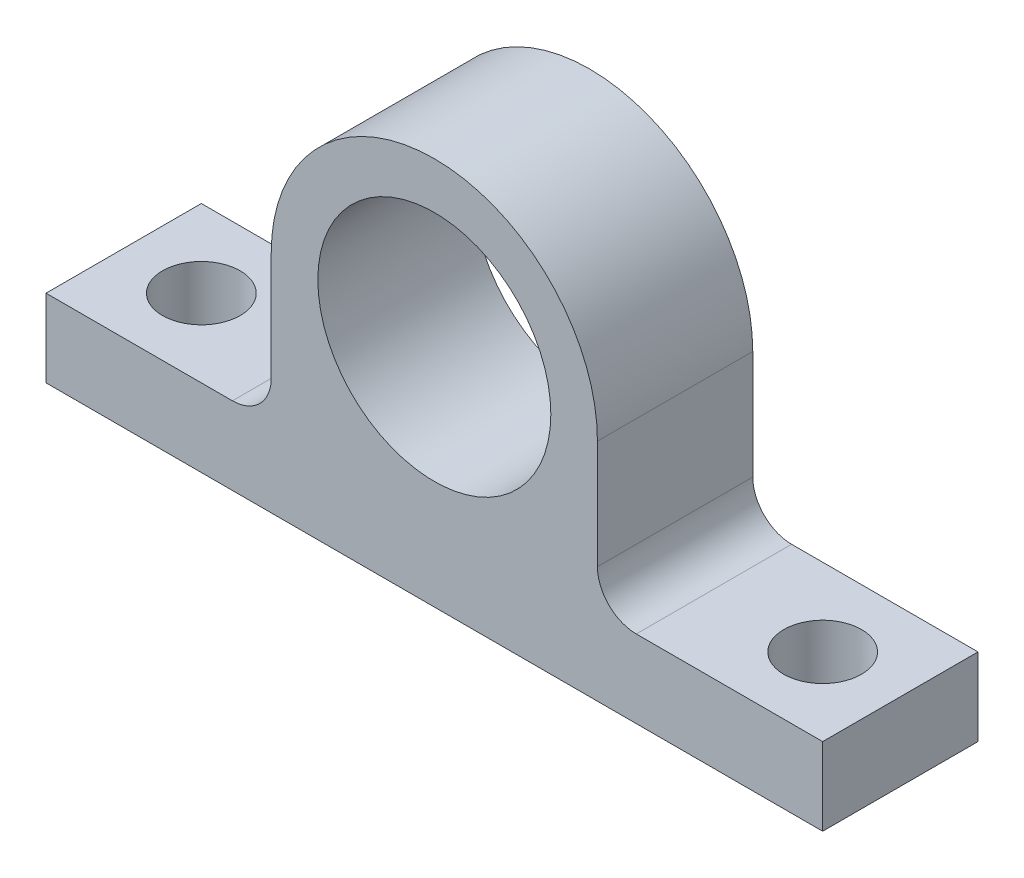
ISO-10303-21;
HEADER;
FILE_DESCRIPTION(('STEP AP214'),'2;1');
FILE_NAME('part.step','',(''),(''),'','','');
FILE_SCHEMA(('AUTOMOTIVE_DESIGN { 1 0 10303 214 1 1 1 1 }'));
ENDSEC;
DATA;
#1=APPLICATION_CONTEXT('core data for automotive mechanical design processes');
#2=APPLICATION_PROTOCOL_DEFINITION('international standard','automotive_design',2000,#1);
#3=PRODUCT_CONTEXT('',#1,'mechanical');
#4=PRODUCT('Part','Part','',(#3));
#5=PRODUCT_RELATED_PRODUCT_CATEGORY('part','',(#4));
#6=PRODUCT_DEFINITION_FORMATION('','',#4);
#7=PRODUCT_DEFINITION_CONTEXT('part definition',#1,'design');
#8=PRODUCT_DEFINITION('design','',#6,#7);
#9=PRODUCT_DEFINITION_SHAPE('','',#8);
#10=(LENGTH_UNIT() NAMED_UNIT(*) SI_UNIT(.MILLI.,.METRE.));
#11=(NAMED_UNIT(*) PLANE_ANGLE_UNIT() SI_UNIT($,.RADIAN.));
#12=(NAMED_UNIT(*) SI_UNIT($,.STERADIAN.) SOLID_ANGLE_UNIT());
#13=UNCERTAINTY_MEASURE_WITH_UNIT(LENGTH_MEASURE(1.E-05),#10,'distance_accuracy_value','');
#14=(GEOMETRIC_REPRESENTATION_CONTEXT(3) GLOBAL_UNCERTAINTY_ASSIGNED_CONTEXT((#13)) GLOBAL_UNIT_ASSIGNED_CONTEXT((#10,
#11,#12)) REPRESENTATION_CONTEXT('',''));
#15=CARTESIAN_POINT('',(0.,0.,0.));
#16=DIRECTION('',(0.,0.,1.));
#17=DIRECTION('',(1.,0.,0.));
#18=AXIS2_PLACEMENT_3D('',#15,#16,#17);
#19=CARTESIAN_POINT('',(0.,14.5,10.));
#20=DIRECTION('',(0.,0.,1.));
#21=DIRECTION('',(1.,0.,0.));
#22=AXIS2_PLACEMENT_3D('',#19,#20,#21);
#23=PLANE('',#22);
#24=CARTESIAN_POINT('',(0.,14.5,10.));
#25=DIRECTION('',(0.,0.,1.));
#26=DIRECTION('',(1.,0.,0.));
#27=AXIS2_PLACEMENT_3D('',#24,#25,#26);
#28=CIRCLE('',#27,10.5);
#29=CARTESIAN_POINT('',(10.5,14.5,10.));
#30=VERTEX_POINT('',#29);
#31=CARTESIAN_POINT('',(-10.5,14.5,10.));
#32=VERTEX_POINT('',#31);
#33=EDGE_CURVE('E161',#30,#32,#28,.T.);
#34=ORIENTED_EDGE('',*,*,#33,.T.);
#35=DIRECTION('',(0.,-1.,0.));
#36=VECTOR('',#35,1.);
#37=CARTESIAN_POINT('',(-10.5,14.5,10.));
#38=LINE('',#37,#36);
#39=CARTESIAN_POINT('',(-10.5,7.50000000000002,10.));
#40=VERTEX_POINT('',#39);
#41=EDGE_CURVE('E99',#32,#40,#38,.T.);
#42=ORIENTED_EDGE('',*,*,#41,.T.);
#43=CARTESIAN_POINT('',(-13.,7.5,10.));
#44=DIRECTION('',(0.,0.,-1.));
#45=DIRECTION('',(-1.,0.,0.));
#46=AXIS2_PLACEMENT_3D('',#43,#44,#45);
#47=CIRCLE('',#46,2.5);
#48=CARTESIAN_POINT('',(-13.,5.,10.));
#49=VERTEX_POINT('',#48);
#50=EDGE_CURVE('E183',#40,#49,#47,.T.);
#51=ORIENTED_EDGE('',*,*,#50,.T.);
#52=DIRECTION('',(-1.,0.,0.));
#53=VECTOR('',#52,1.);
#54=CARTESIAN_POINT('',(-25.,5.,10.));
#55=LINE('',#54,#53);
#56=CARTESIAN_POINT('',(-25.,5.,10.));
#57=VERTEX_POINT('',#56);
#58=EDGE_CURVE('E202',#49,#57,#55,.T.);
#59=ORIENTED_EDGE('',*,*,#58,.T.);
#60=DIRECTION('',(0.,-1.,0.));
#61=VECTOR('',#60,1.);
#62=CARTESIAN_POINT('',(-25.,0.,10.));
#63=LINE('',#62,#61);
#64=CARTESIAN_POINT('',(-25.,0.,10.));
#65=VERTEX_POINT('',#64);
#66=EDGE_CURVE('E199',#57,#65,#63,.T.);
#67=ORIENTED_EDGE('',*,*,#66,.T.);
#68=DIRECTION('',(1.,0.,0.));
#69=VECTOR('',#68,1.);
#70=CARTESIAN_POINT('',(25.,0.,10.));
#71=LINE('',#70,#69);
#72=CARTESIAN_POINT('',(25.,0.,10.));
#73=VERTEX_POINT('',#72);
#74=EDGE_CURVE('E201',#65,#73,#71,.T.);
#75=ORIENTED_EDGE('',*,*,#74,.T.);
#76=DIRECTION('',(0.,1.,0.));
#77=VECTOR('',#76,1.);
#78=CARTESIAN_POINT('',(25.,0.,10.));
#79=LINE('',#78,#77);
#80=CARTESIAN_POINT('',(25.,5.,10.));
#81=VERTEX_POINT('',#80);
#82=EDGE_CURVE('E124',#73,#81,#79,.T.);
#83=ORIENTED_EDGE('',*,*,#82,.T.);
#84=DIRECTION('',(-1.,0.,0.));
#85=VECTOR('',#84,1.);
#86=CARTESIAN_POINT('',(25.,5.,10.));
#87=LINE('',#86,#85);
#88=CARTESIAN_POINT('',(13.,5.,10.));
#89=VERTEX_POINT('',#88);
#90=EDGE_CURVE('E118',#81,#89,#87,.T.);
#91=ORIENTED_EDGE('',*,*,#90,.T.);
#92=CARTESIAN_POINT('',(13.,7.5,10.));
#93=DIRECTION('',(0.,0.,-1.));
#94=DIRECTION('',(1.,0.,0.));
#95=AXIS2_PLACEMENT_3D('',#92,#93,#94);
#96=CIRCLE('',#95,2.5);
#97=CARTESIAN_POINT('',(10.5,7.50000000000002,10.));
#98=VERTEX_POINT('',#97);
#99=EDGE_CURVE('E122',#89,#98,#96,.T.);
#100=ORIENTED_EDGE('',*,*,#99,.T.);
#101=DIRECTION('',(0.,1.,0.));
#102=VECTOR('',#101,1.);
#103=CARTESIAN_POINT('',(10.5,14.5,10.));
#104=LINE('',#103,#102);
#105=EDGE_CURVE('E50',#98,#30,#104,.T.);
#106=ORIENTED_EDGE('',*,*,#105,.T.);
#107=EDGE_LOOP('',(#34,#42,#51,#59,#67,#75,#83,#91,#100,#106));
#108=FACE_BOUND('',#107,.T.);
#109=CARTESIAN_POINT('',(0.,14.5,10.));
#110=DIRECTION('',(0.,0.,1.));
#111=DIRECTION('',(1.,0.,0.));
#112=AXIS2_PLACEMENT_3D('',#109,#110,#111);
#113=CIRCLE('',#112,7.5);
#114=CARTESIAN_POINT('',(7.5,14.5,10.));
#115=VERTEX_POINT('',#114);
#116=EDGE_CURVE('E146',#115,#115,#113,.T.);
#117=ORIENTED_EDGE('',*,*,#116,.F.);
#118=EDGE_LOOP('',(#117));
#119=FACE_BOUND('',#118,.T.);
#120=ADVANCED_FACE('F32',(#108,#119),#23,.T.);
#121=CARTESIAN_POINT('',(0.,14.5,0.));
#122=DIRECTION('',(0.,0.,1.));
#123=DIRECTION('',(1.,0.,0.));
#124=AXIS2_PLACEMENT_3D('',#121,#122,#123);
#125=PLANE('',#124);
#126=CARTESIAN_POINT('',(0.,14.5,0.));
#127=DIRECTION('',(0.,0.,1.));
#128=DIRECTION('',(1.,0.,0.));
#129=AXIS2_PLACEMENT_3D('',#126,#127,#128);
#130=CIRCLE('',#129,10.5);
#131=CARTESIAN_POINT('',(10.5,14.5,0.));
#132=VERTEX_POINT('',#131);
#133=CARTESIAN_POINT('',(-10.5,14.5,0.));
#134=VERTEX_POINT('',#133);
#135=EDGE_CURVE('E142',#132,#134,#130,.T.);
#136=ORIENTED_EDGE('',*,*,#135,.F.);
#137=DIRECTION('',(0.,1.,0.));
#138=VECTOR('',#137,1.);
#139=CARTESIAN_POINT('',(10.5,14.5,0.));
#140=LINE('',#139,#138);
#141=CARTESIAN_POINT('',(10.5,7.50000000000002,0.));
#142=VERTEX_POINT('',#141);
#143=EDGE_CURVE('E91',#142,#132,#140,.T.);
#144=ORIENTED_EDGE('',*,*,#143,.F.);
#145=CARTESIAN_POINT('',(13.,7.5,0.));
#146=DIRECTION('',(0.,0.,-1.));
#147=DIRECTION('',(1.,0.,0.));
#148=AXIS2_PLACEMENT_3D('',#145,#146,#147);
#149=CIRCLE('',#148,2.5);
#150=CARTESIAN_POINT('',(13.,5.,0.));
#151=VERTEX_POINT('',#150);
#152=EDGE_CURVE('E85',#151,#142,#149,.T.);
#153=ORIENTED_EDGE('',*,*,#152,.F.);
#154=DIRECTION('',(-1.,0.,0.));
#155=VECTOR('',#154,1.);
#156=CARTESIAN_POINT('',(25.,5.,0.));
#157=LINE('',#156,#155);
#158=CARTESIAN_POINT('',(25.,5.,0.));
#159=VERTEX_POINT('',#158);
#160=EDGE_CURVE('E132',#159,#151,#157,.T.);
#161=ORIENTED_EDGE('',*,*,#160,.F.);
#162=DIRECTION('',(0.,1.,0.));
#163=VECTOR('',#162,1.);
#164=CARTESIAN_POINT('',(25.,0.,0.));
#165=LINE('',#164,#163);
#166=CARTESIAN_POINT('',(25.,0.,0.));
#167=VERTEX_POINT('',#166);
#168=EDGE_CURVE('E156',#167,#159,#165,.T.);
#169=ORIENTED_EDGE('',*,*,#168,.F.);
#170=DIRECTION('',(1.,0.,0.));
#171=VECTOR('',#170,1.);
#172=CARTESIAN_POINT('',(25.,0.,0.));
#173=LINE('',#172,#171);
#174=CARTESIAN_POINT('',(-25.,0.,0.));
#175=VERTEX_POINT('',#174);
#176=EDGE_CURVE('E154',#175,#167,#173,.T.);
#177=ORIENTED_EDGE('',*,*,#176,.F.);
#178=DIRECTION('',(0.,-1.,0.));
#179=VECTOR('',#178,1.);
#180=CARTESIAN_POINT('',(-25.,0.,0.));
#181=LINE('',#180,#179);
#182=CARTESIAN_POINT('',(-25.,5.,0.));
#183=VERTEX_POINT('',#182);
#184=EDGE_CURVE('E152',#183,#175,#181,.T.);
#185=ORIENTED_EDGE('',*,*,#184,.F.);
#186=DIRECTION('',(-1.,0.,0.));
#187=VECTOR('',#186,1.);
#188=CARTESIAN_POINT('',(-25.,5.,0.));
#189=LINE('',#188,#187);
#190=CARTESIAN_POINT('',(-13.,5.,0.));
#191=VERTEX_POINT('',#190);
#192=EDGE_CURVE('E150',#191,#183,#189,.T.);
#193=ORIENTED_EDGE('',*,*,#192,.F.);
#194=CARTESIAN_POINT('',(-13.,7.5,0.));
#195=DIRECTION('',(0.,0.,-1.));
#196=DIRECTION('',(-1.,0.,0.));
#197=AXIS2_PLACEMENT_3D('',#194,#195,#196);
#198=CIRCLE('',#197,2.5);
#199=CARTESIAN_POINT('',(-10.5,7.50000000000002,0.));
#200=VERTEX_POINT('',#199);
#201=EDGE_CURVE('E148',#200,#191,#198,.T.);
#202=ORIENTED_EDGE('',*,*,#201,.F.);
#203=DIRECTION('',(0.,-1.,0.));
#204=VECTOR('',#203,1.);
#205=CARTESIAN_POINT('',(-10.5,14.5,0.));
#206=LINE('',#205,#204);
#207=EDGE_CURVE('E145',#134,#200,#206,.T.);
#208=ORIENTED_EDGE('',*,*,#207,.F.);
#209=EDGE_LOOP('',(#136,#144,#153,#161,#169,#177,#185,#193,#202,#208));
#210=FACE_BOUND('',#209,.T.);
#211=CARTESIAN_POINT('',(0.,14.5,0.));
#212=DIRECTION('',(0.,0.,1.));
#213=DIRECTION('',(1.,0.,0.));
#214=AXIS2_PLACEMENT_3D('',#211,#212,#213);
#215=CIRCLE('',#214,7.5);
#216=CARTESIAN_POINT('',(7.5,14.5,0.));
#217=VERTEX_POINT('',#216);
#218=EDGE_CURVE('E210',#217,#217,#215,.T.);
#219=ORIENTED_EDGE('',*,*,#218,.T.);
#220=EDGE_LOOP('',(#219));
#221=FACE_BOUND('',#220,.T.);
#222=ADVANCED_FACE('F187',(#210,#221),#125,.F.);
#223=CARTESIAN_POINT('',(0.,14.5,10.));
#224=DIRECTION('',(0.,0.,-1.));
#225=DIRECTION('',(-1.,0.,0.));
#226=AXIS2_PLACEMENT_3D('',#223,#224,#225);
#227=CYLINDRICAL_SURFACE('',#226,10.5);
#228=ORIENTED_EDGE('',*,*,#135,.T.);
#229=DIRECTION('',(0.,0.,-1.));
#230=VECTOR('',#229,1.);
#231=CARTESIAN_POINT('',(-10.5,14.5,10.));
#232=LINE('',#231,#230);
#233=EDGE_CURVE('E11',#32,#134,#232,.T.);
#234=ORIENTED_EDGE('',*,*,#233,.F.);
#235=ORIENTED_EDGE('',*,*,#33,.F.);
#236=DIRECTION('',(0.,0.,-1.));
#237=VECTOR('',#236,1.);
#238=CARTESIAN_POINT('',(10.5,14.5,10.));
#239=LINE('',#238,#237);
#240=EDGE_CURVE('E138',#30,#132,#239,.T.);
#241=ORIENTED_EDGE('',*,*,#240,.T.);
#242=EDGE_LOOP('',(#228,#234,#235,#241));
#243=FACE_BOUND('',#242,.T.);
#244=ADVANCED_FACE('F34',(#243),#227,.T.);
#245=CARTESIAN_POINT('',(-10.5,14.5,10.));
#246=DIRECTION('',(1.,0.,0.));
#247=DIRECTION('',(0.,0.,-1.));
#248=AXIS2_PLACEMENT_3D('',#245,#246,#247);
#249=PLANE('',#248);
#250=ORIENTED_EDGE('',*,*,#207,.T.);
#251=DIRECTION('',(0.,0.,-1.));
#252=VECTOR('',#251,1.);
#253=CARTESIAN_POINT('',(-10.5,7.50000000000002,10.));
#254=LINE('',#253,#252);
#255=EDGE_CURVE('E42',#40,#200,#254,.T.);
#256=ORIENTED_EDGE('',*,*,#255,.F.);
#257=ORIENTED_EDGE('',*,*,#41,.F.);
#258=ORIENTED_EDGE('',*,*,#233,.T.);
#259=EDGE_LOOP('',(#250,#256,#257,#258));
#260=FACE_BOUND('',#259,.T.);
#261=ADVANCED_FACE('F281',(#260),#249,.F.);
#262=CARTESIAN_POINT('',(-13.,7.5,10.));
#263=DIRECTION('',(0.,0.,-1.));
#264=DIRECTION('',(-1.,0.,0.));
#265=AXIS2_PLACEMENT_3D('',#262,#263,#264);
#266=CYLINDRICAL_SURFACE('',#265,2.5);
#267=ORIENTED_EDGE('',*,*,#201,.T.);
#268=DIRECTION('',(0.,0.,-1.));
#269=VECTOR('',#268,1.);
#270=CARTESIAN_POINT('',(-13.,5.,10.));
#271=LINE('',#270,#269);
#272=EDGE_CURVE('E174',#49,#191,#271,.T.);
#273=ORIENTED_EDGE('',*,*,#272,.F.);
#274=ORIENTED_EDGE('',*,*,#50,.F.);
#275=ORIENTED_EDGE('',*,*,#255,.T.);
#276=EDGE_LOOP('',(#267,#273,#274,#275));
#277=FACE_BOUND('',#276,.T.);
#278=ADVANCED_FACE('F181',(#277),#266,.F.);
#279=CARTESIAN_POINT('',(-25.,5.,10.));
#280=DIRECTION('',(0.,-1.,0.));
#281=DIRECTION('',(0.,0.,-1.));
#282=AXIS2_PLACEMENT_3D('',#279,#280,#281);
#283=PLANE('',#282);
#284=CARTESIAN_POINT('',(-20.,5.,5.));
#285=DIRECTION('',(0.,1.,0.));
#286=DIRECTION('',(0.,0.,1.));
#287=AXIS2_PLACEMENT_3D('',#284,#285,#286);
#288=CIRCLE('',#287,2.5);
#289=CARTESIAN_POINT('',(-20.,5.,7.5));
#290=VERTEX_POINT('',#289);
#291=EDGE_CURVE('E215',#290,#290,#288,.T.);
#292=ORIENTED_EDGE('',*,*,#291,.F.);
#293=EDGE_LOOP('',(#292));
#294=FACE_BOUND('',#293,.T.);
#295=ORIENTED_EDGE('',*,*,#192,.T.);
#296=DIRECTION('',(0.,0.,-1.));
#297=VECTOR('',#296,1.);
#298=CARTESIAN_POINT('',(-25.,5.,10.));
#299=LINE('',#298,#297);
#300=EDGE_CURVE('E171',#57,#183,#299,.T.);
#301=ORIENTED_EDGE('',*,*,#300,.F.);
#302=ORIENTED_EDGE('',*,*,#58,.F.);
#303=ORIENTED_EDGE('',*,*,#272,.T.);
#304=EDGE_LOOP('',(#295,#301,#302,#303));
#305=FACE_BOUND('',#304,.T.);
#306=ADVANCED_FACE('F193',(#294,#305),#283,.F.);
#307=CARTESIAN_POINT('',(-25.,0.,10.));
#308=DIRECTION('',(1.,0.,0.));
#309=DIRECTION('',(0.,0.,-1.));
#310=AXIS2_PLACEMENT_3D('',#307,#308,#309);
#311=PLANE('',#310);
#312=ORIENTED_EDGE('',*,*,#184,.T.);
#313=DIRECTION('',(0.,0.,-1.));
#314=VECTOR('',#313,1.);
#315=CARTESIAN_POINT('',(-25.,0.,10.));
#316=LINE('',#315,#314);
#317=EDGE_CURVE('E168',#65,#175,#316,.T.);
#318=ORIENTED_EDGE('',*,*,#317,.F.);
#319=ORIENTED_EDGE('',*,*,#66,.F.);
#320=ORIENTED_EDGE('',*,*,#300,.T.);
#321=EDGE_LOOP('',(#312,#318,#319,#320));
#322=FACE_BOUND('',#321,.T.);
#323=ADVANCED_FACE('F197',(#322),#311,.F.);
#324=CARTESIAN_POINT('',(25.,0.,10.));
#325=DIRECTION('',(0.,1.,0.));
#326=DIRECTION('',(0.,0.,1.));
#327=AXIS2_PLACEMENT_3D('',#324,#325,#326);
#328=PLANE('',#327);
#329=CARTESIAN_POINT('',(20.,0.,5.));
#330=DIRECTION('',(0.,1.,0.));
#331=DIRECTION('',(0.,0.,1.));
#332=AXIS2_PLACEMENT_3D('',#329,#330,#331);
#333=CIRCLE('',#332,2.5);
#334=CARTESIAN_POINT('',(20.,0.,7.5));
#335=VERTEX_POINT('',#334);
#336=EDGE_CURVE('E218',#335,#335,#333,.T.);
#337=ORIENTED_EDGE('',*,*,#336,.T.);
#338=EDGE_LOOP('',(#337));
#339=FACE_BOUND('',#338,.T.);
#340=CARTESIAN_POINT('',(-20.,0.,5.));
#341=DIRECTION('',(0.,1.,0.));
#342=DIRECTION('',(0.,0.,1.));
#343=AXIS2_PLACEMENT_3D('',#340,#341,#342);
#344=CIRCLE('',#343,2.5);
#345=CARTESIAN_POINT('',(-20.,0.,7.5));
#346=VERTEX_POINT('',#345);
#347=EDGE_CURVE('E36',#346,#346,#344,.T.);
#348=ORIENTED_EDGE('',*,*,#347,.T.);
#349=EDGE_LOOP('',(#348));
#350=FACE_BOUND('',#349,.T.);
#351=ORIENTED_EDGE('',*,*,#176,.T.);
#352=DIRECTION('',(0.,0.,-1.));
#353=VECTOR('',#352,1.);
#354=CARTESIAN_POINT('',(25.,0.,10.));
#355=LINE('',#354,#353);
#356=EDGE_CURVE('E165',#73,#167,#355,.T.);
#357=ORIENTED_EDGE('',*,*,#356,.F.);
#358=ORIENTED_EDGE('',*,*,#74,.F.);
#359=ORIENTED_EDGE('',*,*,#317,.T.);
#360=EDGE_LOOP('',(#351,#357,#358,#359));
#361=FACE_BOUND('',#360,.T.);
#362=ADVANCED_FACE('F237',(#339,#350,#361),#328,.F.);
#363=CARTESIAN_POINT('',(25.,0.,10.));
#364=DIRECTION('',(-1.,0.,0.));
#365=DIRECTION('',(0.,0.,1.));
#366=AXIS2_PLACEMENT_3D('',#363,#364,#365);
#367=PLANE('',#366);
#368=ORIENTED_EDGE('',*,*,#168,.T.);
#369=DIRECTION('',(0.,0.,-1.));
#370=VECTOR('',#369,1.);
#371=CARTESIAN_POINT('',(25.,5.,10.));
#372=LINE('',#371,#370);
#373=EDGE_CURVE('E133',#81,#159,#372,.T.);
#374=ORIENTED_EDGE('',*,*,#373,.F.);
#375=ORIENTED_EDGE('',*,*,#82,.F.);
#376=ORIENTED_EDGE('',*,*,#356,.T.);
#377=EDGE_LOOP('',(#368,#374,#375,#376));
#378=FACE_BOUND('',#377,.T.);
#379=ADVANCED_FACE('F229',(#378),#367,.F.);
#380=CARTESIAN_POINT('',(25.,5.,10.));
#381=DIRECTION('',(0.,-1.,0.));
#382=DIRECTION('',(0.,0.,-1.));
#383=AXIS2_PLACEMENT_3D('',#380,#381,#382);
#384=PLANE('',#383);
#385=CARTESIAN_POINT('',(20.,5.,5.));
#386=DIRECTION('',(0.,1.,0.));
#387=DIRECTION('',(0.,0.,-1.));
#388=AXIS2_PLACEMENT_3D('',#385,#386,#387);
#389=CIRCLE('',#388,2.5);
#390=CARTESIAN_POINT('',(20.,5.,2.5));
#391=VERTEX_POINT('',#390);
#392=EDGE_CURVE('E221',#391,#391,#389,.T.);
#393=ORIENTED_EDGE('',*,*,#392,.F.);
#394=EDGE_LOOP('',(#393));
#395=FACE_BOUND('',#394,.T.);
#396=ORIENTED_EDGE('',*,*,#160,.T.);
#397=DIRECTION('',(0.,0.,-1.));
#398=VECTOR('',#397,1.);
#399=CARTESIAN_POINT('',(13.,5.,10.));
#400=LINE('',#399,#398);
#401=EDGE_CURVE('E129',#89,#151,#400,.T.);
#402=ORIENTED_EDGE('',*,*,#401,.F.);
#403=ORIENTED_EDGE('',*,*,#90,.F.);
#404=ORIENTED_EDGE('',*,*,#373,.T.);
#405=EDGE_LOOP('',(#396,#402,#403,#404));
#406=FACE_BOUND('',#405,.T.);
#407=ADVANCED_FACE('F130',(#395,#406),#384,.F.);
#408=CARTESIAN_POINT('',(13.,7.5,10.));
#409=DIRECTION('',(0.,0.,-1.));
#410=DIRECTION('',(-1.,0.,0.));
#411=AXIS2_PLACEMENT_3D('',#408,#409,#410);
#412=CYLINDRICAL_SURFACE('',#411,2.5);
#413=ORIENTED_EDGE('',*,*,#152,.T.);
#414=DIRECTION('',(0.,0.,-1.));
#415=VECTOR('',#414,1.);
#416=CARTESIAN_POINT('',(10.5,7.50000000000002,10.));
#417=LINE('',#416,#415);
#418=EDGE_CURVE('E134',#98,#142,#417,.T.);
#419=ORIENTED_EDGE('',*,*,#418,.F.);
#420=ORIENTED_EDGE('',*,*,#99,.F.);
#421=ORIENTED_EDGE('',*,*,#401,.T.);
#422=EDGE_LOOP('',(#413,#419,#420,#421));
#423=FACE_BOUND('',#422,.T.);
#424=ADVANCED_FACE('F136',(#423),#412,.F.);
#425=CARTESIAN_POINT('',(10.5,14.5,10.));
#426=DIRECTION('',(-1.,0.,0.));
#427=DIRECTION('',(0.,0.,1.));
#428=AXIS2_PLACEMENT_3D('',#425,#426,#427);
#429=PLANE('',#428);
#430=ORIENTED_EDGE('',*,*,#143,.T.);
#431=ORIENTED_EDGE('',*,*,#240,.F.);
#432=ORIENTED_EDGE('',*,*,#105,.F.);
#433=ORIENTED_EDGE('',*,*,#418,.T.);
#434=EDGE_LOOP('',(#430,#431,#432,#433));
#435=FACE_BOUND('',#434,.T.);
#436=ADVANCED_FACE('F235',(#435),#429,.F.);
#437=CARTESIAN_POINT('',(0.,14.5,10.));
#438=DIRECTION('',(0.,0.,-1.));
#439=DIRECTION('',(-1.,0.,0.));
#440=AXIS2_PLACEMENT_3D('',#437,#438,#439);
#441=CYLINDRICAL_SURFACE('',#440,7.5);
#442=ORIENTED_EDGE('',*,*,#116,.T.);
#443=EDGE_LOOP('',(#442));
#444=FACE_BOUND('',#443,.T.);
#445=ORIENTED_EDGE('',*,*,#218,.F.);
#446=EDGE_LOOP('',(#445));
#447=FACE_BOUND('',#446,.T.);
#448=ADVANCED_FACE('F247',(#444,#447),#441,.F.);
#449=CARTESIAN_POINT('',(-20.,-17.,5.));
#450=DIRECTION('',(0.,1.,0.));
#451=DIRECTION('',(0.,0.,1.));
#452=AXIS2_PLACEMENT_3D('',#449,#450,#451);
#453=CYLINDRICAL_SURFACE('',#452,2.5);
#454=ORIENTED_EDGE('',*,*,#291,.T.);
#455=EDGE_LOOP('',(#454));
#456=FACE_BOUND('',#455,.T.);
#457=ORIENTED_EDGE('',*,*,#347,.F.);
#458=EDGE_LOOP('',(#457));
#459=FACE_BOUND('',#458,.T.);
#460=ADVANCED_FACE('F254',(#456,#459),#453,.F.);
#461=CARTESIAN_POINT('',(20.,-17.,5.));
#462=DIRECTION('',(0.,1.,0.));
#463=DIRECTION('',(0.,0.,1.));
#464=AXIS2_PLACEMENT_3D('',#461,#462,#463);
#465=CYLINDRICAL_SURFACE('',#464,2.5);
#466=ORIENTED_EDGE('',*,*,#392,.T.);
#467=EDGE_LOOP('',(#466));
#468=FACE_BOUND('',#467,.T.);
#469=ORIENTED_EDGE('',*,*,#336,.F.);
#470=EDGE_LOOP('',(#469));
#471=FACE_BOUND('',#470,.T.);
#472=ADVANCED_FACE('F225',(#468,#471),#465,.F.);
#473=CLOSED_SHELL('',(#120,#222,#244,#261,#278,#306,#323,#362,#379,#407,#424,#436,#448,#460,#472));
#474=MANIFOLD_SOLID_BREP('B2',#473);
#475=ADVANCED_BREP_SHAPE_REPRESENTATION('',(#18,#474),#14);
#476=SHAPE_DEFINITION_REPRESENTATION(#9,#475);
ENDSEC;
END-ISO-10303-21;
